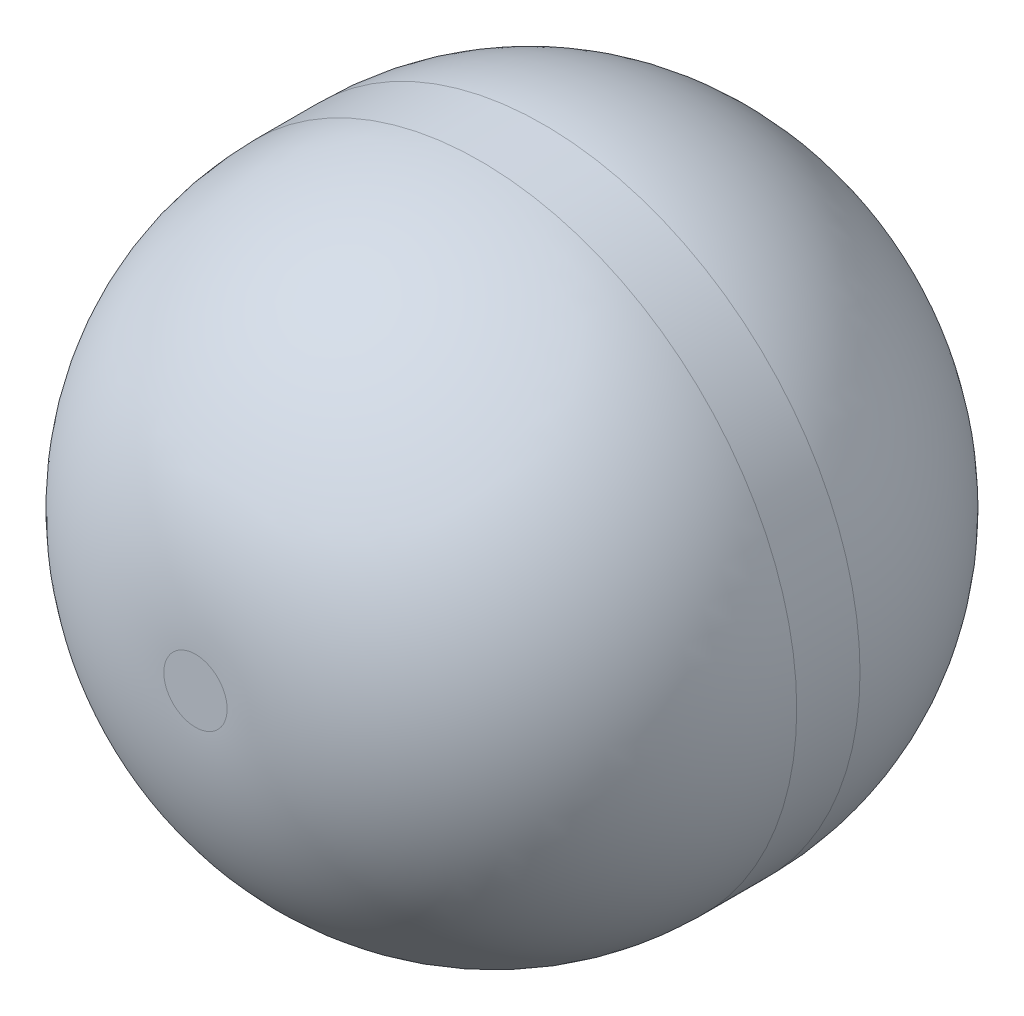
ISO-10303-21;
HEADER;
FILE_DESCRIPTION(('STEP AP214'),'2;1');
FILE_NAME('part.step','',(''),(''),'','','');
FILE_SCHEMA(('AUTOMOTIVE_DESIGN { 1 0 10303 214 1 1 1 1 }'));
ENDSEC;
DATA;
#1=APPLICATION_CONTEXT('core data for automotive mechanical design processes');
#2=APPLICATION_PROTOCOL_DEFINITION('international standard','automotive_design',2000,#1);
#3=PRODUCT_CONTEXT('',#1,'mechanical');
#4=PRODUCT('Part','Part','',(#3));
#5=PRODUCT_RELATED_PRODUCT_CATEGORY('part','',(#4));
#6=PRODUCT_DEFINITION_FORMATION('','',#4);
#7=PRODUCT_DEFINITION_CONTEXT('part definition',#1,'design');
#8=PRODUCT_DEFINITION('design','',#6,#7);
#9=PRODUCT_DEFINITION_SHAPE('','',#8);
#10=(LENGTH_UNIT() NAMED_UNIT(*) SI_UNIT(.MILLI.,.METRE.));
#11=(NAMED_UNIT(*) PLANE_ANGLE_UNIT() SI_UNIT($,.RADIAN.));
#12=(NAMED_UNIT(*) SI_UNIT($,.STERADIAN.) SOLID_ANGLE_UNIT());
#13=UNCERTAINTY_MEASURE_WITH_UNIT(LENGTH_MEASURE(1.E-05),#10,'distance_accuracy_value','');
#14=(GEOMETRIC_REPRESENTATION_CONTEXT(3) GLOBAL_UNCERTAINTY_ASSIGNED_CONTEXT((#13)) GLOBAL_UNIT_ASSIGNED_CONTEXT((#10,
#11,#12)) REPRESENTATION_CONTEXT('',''));
#15=CARTESIAN_POINT('',(0.,0.,0.));
#16=DIRECTION('',(0.,0.,1.));
#17=DIRECTION('',(1.,0.,0.));
#18=AXIS2_PLACEMENT_3D('',#15,#16,#17);
#19=CARTESIAN_POINT('',(0.,0.,50.));
#20=DIRECTION('',(0.,0.,-1.));
#21=DIRECTION('',(-1.,0.,0.));
#22=AXIS2_PLACEMENT_3D('',#19,#20,#21);
#23=CYLINDRICAL_SURFACE('',#22,50.);
#24=CARTESIAN_POINT('',(0.,0.,-5.));
#25=DIRECTION('',(0.,0.,1.));
#26=DIRECTION('',(1.,0.,0.));
#27=AXIS2_PLACEMENT_3D('',#24,#25,#26);
#28=CIRCLE('',#27,50.);
#29=CARTESIAN_POINT('',(50.,0.,-5.));
#30=VERTEX_POINT('',#29);
#31=EDGE_CURVE('E52',#30,#30,#28,.T.);
#32=ORIENTED_EDGE('',*,*,#31,.T.);
#33=EDGE_LOOP('',(#32));
#34=FACE_BOUND('',#33,.T.);
#35=CARTESIAN_POINT('',(0.,0.,5.));
#36=DIRECTION('',(0.,0.,1.));
#37=DIRECTION('',(1.,0.,0.));
#38=AXIS2_PLACEMENT_3D('',#35,#36,#37);
#39=CIRCLE('',#38,50.);
#40=CARTESIAN_POINT('',(50.,0.,5.));
#41=VERTEX_POINT('',#40);
#42=EDGE_CURVE('E57',#41,#41,#39,.F.);
#43=ORIENTED_EDGE('',*,*,#42,.T.);
#44=EDGE_LOOP('',(#43));
#45=FACE_BOUND('',#44,.T.);
#46=ADVANCED_FACE('F39',(#34,#45),#23,.T.);
#47=CARTESIAN_POINT('',(0.,0.,50.));
#48=DIRECTION('',(0.,0.,1.));
#49=DIRECTION('',(1.,0.,0.));
#50=AXIS2_PLACEMENT_3D('',#47,#48,#49);
#51=PLANE('',#50);
#52=CARTESIAN_POINT('',(0.,0.,50.));
#53=DIRECTION('',(0.,0.,1.));
#54=DIRECTION('',(1.,0.,0.));
#55=AXIS2_PLACEMENT_3D('',#52,#53,#54);
#56=CIRCLE('',#55,5.);
#57=CARTESIAN_POINT('',(5.,0.,50.));
#58=VERTEX_POINT('',#57);
#59=EDGE_CURVE('E10',#58,#58,#56,.T.);
#60=ORIENTED_EDGE('',*,*,#59,.T.);
#61=EDGE_LOOP('',(#60));
#62=FACE_BOUND('',#61,.T.);
#63=ADVANCED_FACE('F74',(#62),#51,.T.);
#64=CARTESIAN_POINT('',(0.,0.,-50.));
#65=DIRECTION('',(0.,0.,1.));
#66=DIRECTION('',(1.,0.,0.));
#67=AXIS2_PLACEMENT_3D('',#64,#65,#66);
#68=PLANE('',#67);
#69=CARTESIAN_POINT('',(0.,0.,-50.));
#70=DIRECTION('',(0.,0.,1.));
#71=DIRECTION('',(1.,0.,0.));
#72=AXIS2_PLACEMENT_3D('',#69,#70,#71);
#73=CIRCLE('',#72,5.);
#74=CARTESIAN_POINT('',(5.,0.,-50.));
#75=VERTEX_POINT('',#74);
#76=EDGE_CURVE('E47',#75,#75,#73,.F.);
#77=ORIENTED_EDGE('',*,*,#76,.T.);
#78=EDGE_LOOP('',(#77));
#79=FACE_BOUND('',#78,.T.);
#80=ADVANCED_FACE('F71',(#79),#68,.F.);
#81=CARTESIAN_POINT('',(0.,0.,-5.));
#82=DIRECTION('',(0.,0.,1.));
#83=DIRECTION('',(1.,0.,0.));
#84=AXIS2_PLACEMENT_3D('',#81,#82,#83);
#85=DEGENERATE_TOROIDAL_SURFACE('',#84,5.,45.,.T.);
#86=ORIENTED_EDGE('',*,*,#76,.F.);
#87=EDGE_LOOP('',(#86));
#88=FACE_BOUND('',#87,.T.);
#89=ORIENTED_EDGE('',*,*,#31,.F.);
#90=EDGE_LOOP('',(#89));
#91=FACE_BOUND('',#90,.T.);
#92=ADVANCED_FACE('F67',(#88,#91),#85,.T.);
#93=CARTESIAN_POINT('',(0.,0.,5.));
#94=DIRECTION('',(0.,0.,1.));
#95=DIRECTION('',(1.,0.,0.));
#96=AXIS2_PLACEMENT_3D('',#93,#94,#95);
#97=DEGENERATE_TOROIDAL_SURFACE('',#96,5.,45.,.T.);
#98=ORIENTED_EDGE('',*,*,#42,.F.);
#99=EDGE_LOOP('',(#98));
#100=FACE_BOUND('',#99,.T.);
#101=ORIENTED_EDGE('',*,*,#59,.F.);
#102=EDGE_LOOP('',(#101));
#103=FACE_BOUND('',#102,.T.);
#104=ADVANCED_FACE('F41',(#100,#103),#97,.T.);
#105=CLOSED_SHELL('',(#46,#63,#80,#92,#104));
#106=MANIFOLD_SOLID_BREP('B2',#105);
#107=ADVANCED_BREP_SHAPE_REPRESENTATION('',(#18,#106),#14);
#108=SHAPE_DEFINITION_REPRESENTATION(#9,#107);
ENDSEC;
END-ISO-10303-21;
